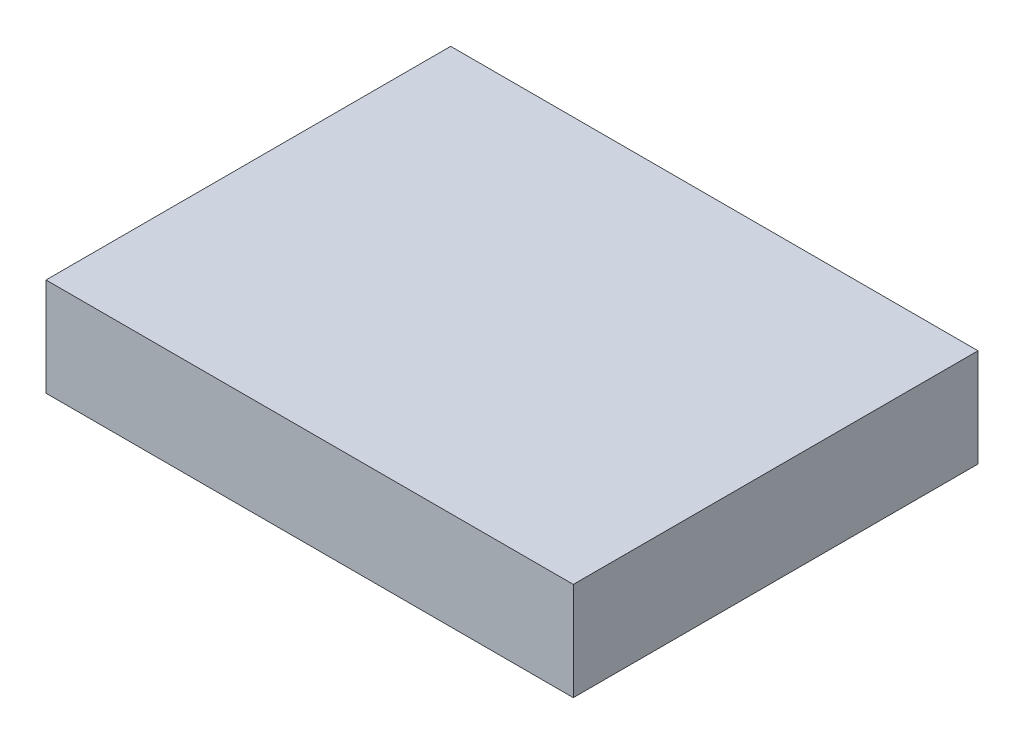
ISO-10303-21;
HEADER;
FILE_DESCRIPTION(('STEP AP214'),'2;1');
FILE_NAME('part.step','',(''),(''),'','','');
FILE_SCHEMA(('AUTOMOTIVE_DESIGN { 1 0 10303 214 1 1 1 1 }'));
ENDSEC;
DATA;
#1=APPLICATION_CONTEXT('core data for automotive mechanical design processes');
#2=APPLICATION_PROTOCOL_DEFINITION('international standard','automotive_design',2000,#1);
#3=PRODUCT_CONTEXT('',#1,'mechanical');
#4=PRODUCT('Part','Part','',(#3));
#5=PRODUCT_RELATED_PRODUCT_CATEGORY('part','',(#4));
#6=PRODUCT_DEFINITION_FORMATION('','',#4);
#7=PRODUCT_DEFINITION_CONTEXT('part definition',#1,'design');
#8=PRODUCT_DEFINITION('design','',#6,#7);
#9=PRODUCT_DEFINITION_SHAPE('','',#8);
#10=(LENGTH_UNIT() NAMED_UNIT(*) SI_UNIT(.MILLI.,.METRE.));
#11=(NAMED_UNIT(*) PLANE_ANGLE_UNIT() SI_UNIT($,.RADIAN.));
#12=(NAMED_UNIT(*) SI_UNIT($,.STERADIAN.) SOLID_ANGLE_UNIT());
#13=UNCERTAINTY_MEASURE_WITH_UNIT(LENGTH_MEASURE(1.E-05),#10,'distance_accuracy_value','');
#14=(GEOMETRIC_REPRESENTATION_CONTEXT(3) GLOBAL_UNCERTAINTY_ASSIGNED_CONTEXT((#13)) GLOBAL_UNIT_ASSIGNED_CONTEXT((#10,
#11,#12)) REPRESENTATION_CONTEXT('',''));
#15=CARTESIAN_POINT('',(0.,0.,0.));
#16=DIRECTION('',(0.,0.,1.));
#17=DIRECTION('',(1.,0.,0.));
#18=AXIS2_PLACEMENT_3D('',#15,#16,#17);
#19=CARTESIAN_POINT('',(43.,16.,33.));
#20=DIRECTION('',(-1.,0.,0.));
#21=DIRECTION('',(0.,0.,1.));
#22=AXIS2_PLACEMENT_3D('',#19,#20,#21);
#23=PLANE('',#22);
#24=DIRECTION('',(0.,0.,-1.));
#25=VECTOR('',#24,1.);
#26=CARTESIAN_POINT('',(43.,0.,33.));
#27=LINE('',#26,#25);
#28=CARTESIAN_POINT('',(43.,0.,33.));
#29=VERTEX_POINT('',#28);
#30=CARTESIAN_POINT('',(43.,0.,-33.));
#31=VERTEX_POINT('',#30);
#32=EDGE_CURVE('E150',#29,#31,#27,.T.);
#33=ORIENTED_EDGE('',*,*,#32,.T.);
#34=DIRECTION('',(0.,-1.,0.));
#35=VECTOR('',#34,1.);
#36=CARTESIAN_POINT('',(43.,16.,-33.));
#37=LINE('',#36,#35);
#38=CARTESIAN_POINT('',(43.,16.,-33.));
#39=VERTEX_POINT('',#38);
#40=EDGE_CURVE('E11',#39,#31,#37,.T.);
#41=ORIENTED_EDGE('',*,*,#40,.F.);
#42=DIRECTION('',(0.,0.,-1.));
#43=VECTOR('',#42,1.);
#44=CARTESIAN_POINT('',(43.,16.,33.));
#45=LINE('',#44,#43);
#46=CARTESIAN_POINT('',(43.,16.,33.));
#47=VERTEX_POINT('',#46);
#48=EDGE_CURVE('E151',#47,#39,#45,.T.);
#49=ORIENTED_EDGE('',*,*,#48,.F.);
#50=DIRECTION('',(0.,-1.,0.));
#51=VECTOR('',#50,1.);
#52=CARTESIAN_POINT('',(43.,16.,33.));
#53=LINE('',#52,#51);
#54=EDGE_CURVE('E160',#47,#29,#53,.T.);
#55=ORIENTED_EDGE('',*,*,#54,.T.);
#56=EDGE_LOOP('',(#33,#41,#49,#55));
#57=FACE_BOUND('',#56,.T.);
#58=ADVANCED_FACE('F39',(#57),#23,.F.);
#59=CARTESIAN_POINT('',(-43.,16.,-33.));
#60=DIRECTION('',(0.,0.,1.));
#61=DIRECTION('',(1.,0.,0.));
#62=AXIS2_PLACEMENT_3D('',#59,#60,#61);
#63=PLANE('',#62);
#64=DIRECTION('',(-1.,0.,0.));
#65=VECTOR('',#64,1.);
#66=CARTESIAN_POINT('',(-43.,0.,-33.));
#67=LINE('',#66,#65);
#68=CARTESIAN_POINT('',(-43.,0.,-33.));
#69=VERTEX_POINT('',#68);
#70=EDGE_CURVE('E158',#31,#69,#67,.T.);
#71=ORIENTED_EDGE('',*,*,#70,.T.);
#72=DIRECTION('',(0.,-1.,0.));
#73=VECTOR('',#72,1.);
#74=CARTESIAN_POINT('',(-43.,16.,-33.));
#75=LINE('',#74,#73);
#76=CARTESIAN_POINT('',(-43.,16.,-33.));
#77=VERTEX_POINT('',#76);
#78=EDGE_CURVE('E46',#77,#69,#75,.T.);
#79=ORIENTED_EDGE('',*,*,#78,.F.);
#80=DIRECTION('',(-1.,0.,0.));
#81=VECTOR('',#80,1.);
#82=CARTESIAN_POINT('',(-43.,16.,-33.));
#83=LINE('',#82,#81);
#84=EDGE_CURVE('E87',#39,#77,#83,.T.);
#85=ORIENTED_EDGE('',*,*,#84,.F.);
#86=ORIENTED_EDGE('',*,*,#40,.T.);
#87=EDGE_LOOP('',(#71,#79,#85,#86));
#88=FACE_BOUND('',#87,.T.);
#89=ADVANCED_FACE('F186',(#88),#63,.F.);
#90=CARTESIAN_POINT('',(-43.,16.,33.));
#91=DIRECTION('',(1.,0.,0.));
#92=DIRECTION('',(0.,0.,-1.));
#93=AXIS2_PLACEMENT_3D('',#90,#91,#92);
#94=PLANE('',#93);
#95=DIRECTION('',(0.,0.,1.));
#96=VECTOR('',#95,1.);
#97=CARTESIAN_POINT('',(-43.,0.,33.));
#98=LINE('',#97,#96);
#99=CARTESIAN_POINT('',(-43.,0.,33.));
#100=VERTEX_POINT('',#99);
#101=EDGE_CURVE('E165',#69,#100,#98,.T.);
#102=ORIENTED_EDGE('',*,*,#101,.T.);
#103=DIRECTION('',(0.,-1.,0.));
#104=VECTOR('',#103,1.);
#105=CARTESIAN_POINT('',(-43.,16.,33.));
#106=LINE('',#105,#104);
#107=CARTESIAN_POINT('',(-43.,16.,33.));
#108=VERTEX_POINT('',#107);
#109=EDGE_CURVE('E166',#108,#100,#106,.T.);
#110=ORIENTED_EDGE('',*,*,#109,.F.);
#111=DIRECTION('',(0.,0.,1.));
#112=VECTOR('',#111,1.);
#113=CARTESIAN_POINT('',(-43.,16.,33.));
#114=LINE('',#113,#112);
#115=EDGE_CURVE('E153',#77,#108,#114,.T.);
#116=ORIENTED_EDGE('',*,*,#115,.F.);
#117=ORIENTED_EDGE('',*,*,#78,.T.);
#118=EDGE_LOOP('',(#102,#110,#116,#117));
#119=FACE_BOUND('',#118,.T.);
#120=ADVANCED_FACE('F172',(#119),#94,.F.);
#121=CARTESIAN_POINT('',(-43.,16.,33.));
#122=DIRECTION('',(0.,0.,-1.));
#123=DIRECTION('',(-1.,0.,0.));
#124=AXIS2_PLACEMENT_3D('',#121,#122,#123);
#125=PLANE('',#124);
#126=DIRECTION('',(1.,0.,0.));
#127=VECTOR('',#126,1.);
#128=CARTESIAN_POINT('',(-43.,0.,33.));
#129=LINE('',#128,#127);
#130=EDGE_CURVE('E81',#100,#29,#129,.T.);
#131=ORIENTED_EDGE('',*,*,#130,.T.);
#132=ORIENTED_EDGE('',*,*,#54,.F.);
#133=DIRECTION('',(1.,0.,0.));
#134=VECTOR('',#133,1.);
#135=CARTESIAN_POINT('',(-43.,16.,33.));
#136=LINE('',#135,#134);
#137=EDGE_CURVE('E65',#108,#47,#136,.T.);
#138=ORIENTED_EDGE('',*,*,#137,.F.);
#139=ORIENTED_EDGE('',*,*,#109,.T.);
#140=EDGE_LOOP('',(#131,#132,#138,#139));
#141=FACE_BOUND('',#140,.T.);
#142=ADVANCED_FACE('F177',(#141),#125,.F.);
#143=CARTESIAN_POINT('',(0.,16.,0.));
#144=DIRECTION('',(0.,-1.,0.));
#145=DIRECTION('',(0.,0.,-1.));
#146=AXIS2_PLACEMENT_3D('',#143,#144,#145);
#147=PLANE('',#146);
#148=ORIENTED_EDGE('',*,*,#48,.T.);
#149=ORIENTED_EDGE('',*,*,#84,.T.);
#150=ORIENTED_EDGE('',*,*,#115,.T.);
#151=ORIENTED_EDGE('',*,*,#137,.T.);
#152=EDGE_LOOP('',(#148,#149,#150,#151));
#153=FACE_BOUND('',#152,.T.);
#154=ADVANCED_FACE('F183',(#153),#147,.F.);
#155=CARTESIAN_POINT('',(0.,0.,0.));
#156=DIRECTION('',(0.,-1.,0.));
#157=DIRECTION('',(0.,0.,-1.));
#158=AXIS2_PLACEMENT_3D('',#155,#156,#157);
#159=PLANE('',#158);
#160=DIRECTION('',(0.,0.,1.));
#161=VECTOR('',#160,1.);
#162=CARTESIAN_POINT('',(40.6,0.,-30.6));
#163=LINE('',#162,#161);
#164=CARTESIAN_POINT('',(40.6,0.,-30.6));
#165=VERTEX_POINT('',#164);
#166=CARTESIAN_POINT('',(40.6,0.,30.6));
#167=VERTEX_POINT('',#166);
#168=EDGE_CURVE('E52',#165,#167,#163,.T.);
#169=ORIENTED_EDGE('',*,*,#168,.F.);
#170=DIRECTION('',(1.,0.,0.));
#171=VECTOR('',#170,1.);
#172=CARTESIAN_POINT('',(-40.6,0.,-30.6));
#173=LINE('',#172,#171);
#174=CARTESIAN_POINT('',(-40.6,0.,-30.6));
#175=VERTEX_POINT('',#174);
#176=EDGE_CURVE('E132',#175,#165,#173,.T.);
#177=ORIENTED_EDGE('',*,*,#176,.F.);
#178=DIRECTION('',(0.,0.,-1.));
#179=VECTOR('',#178,1.);
#180=CARTESIAN_POINT('',(-40.6,0.,-30.6));
#181=LINE('',#180,#179);
#182=CARTESIAN_POINT('',(-40.6,0.,30.6));
#183=VERTEX_POINT('',#182);
#184=EDGE_CURVE('E134',#183,#175,#181,.T.);
#185=ORIENTED_EDGE('',*,*,#184,.F.);
#186=DIRECTION('',(-1.,0.,0.));
#187=VECTOR('',#186,1.);
#188=CARTESIAN_POINT('',(-40.6,0.,30.6));
#189=LINE('',#188,#187);
#190=EDGE_CURVE('E141',#167,#183,#189,.T.);
#191=ORIENTED_EDGE('',*,*,#190,.F.);
#192=EDGE_LOOP('',(#169,#177,#185,#191));
#193=FACE_BOUND('',#192,.T.);
#194=ORIENTED_EDGE('',*,*,#32,.F.);
#195=ORIENTED_EDGE('',*,*,#130,.F.);
#196=ORIENTED_EDGE('',*,*,#101,.F.);
#197=ORIENTED_EDGE('',*,*,#70,.F.);
#198=EDGE_LOOP('',(#194,#195,#196,#197));
#199=FACE_BOUND('',#198,.T.);
#200=ADVANCED_FACE('F173',(#193,#199),#159,.T.);
#201=CARTESIAN_POINT('',(40.6,13.6,-30.6));
#202=DIRECTION('',(1.,0.,0.));
#203=DIRECTION('',(0.,0.,-1.));
#204=AXIS2_PLACEMENT_3D('',#201,#202,#203);
#205=PLANE('',#204);
#206=ORIENTED_EDGE('',*,*,#168,.T.);
#207=DIRECTION('',(0.,-1.,0.));
#208=VECTOR('',#207,1.);
#209=CARTESIAN_POINT('',(40.6,13.6,30.6));
#210=LINE('',#209,#208);
#211=CARTESIAN_POINT('',(40.6,13.6,30.6));
#212=VERTEX_POINT('',#211);
#213=EDGE_CURVE('E108',#212,#167,#210,.T.);
#214=ORIENTED_EDGE('',*,*,#213,.F.);
#215=DIRECTION('',(0.,0.,1.));
#216=VECTOR('',#215,1.);
#217=CARTESIAN_POINT('',(40.6,13.6,-30.6));
#218=LINE('',#217,#216);
#219=CARTESIAN_POINT('',(40.6,13.6,-30.6));
#220=VERTEX_POINT('',#219);
#221=EDGE_CURVE('E111',#220,#212,#218,.T.);
#222=ORIENTED_EDGE('',*,*,#221,.F.);
#223=DIRECTION('',(0.,-1.,0.));
#224=VECTOR('',#223,1.);
#225=CARTESIAN_POINT('',(40.6,13.6,-30.6));
#226=LINE('',#225,#224);
#227=EDGE_CURVE('E144',#220,#165,#226,.T.);
#228=ORIENTED_EDGE('',*,*,#227,.T.);
#229=EDGE_LOOP('',(#206,#214,#222,#228));
#230=FACE_BOUND('',#229,.T.);
#231=ADVANCED_FACE('F115',(#230),#205,.F.);
#232=CARTESIAN_POINT('',(-40.6,13.6,-30.6));
#233=DIRECTION('',(0.,0.,-1.));
#234=DIRECTION('',(-1.,0.,0.));
#235=AXIS2_PLACEMENT_3D('',#232,#233,#234);
#236=PLANE('',#235);
#237=ORIENTED_EDGE('',*,*,#176,.T.);
#238=ORIENTED_EDGE('',*,*,#227,.F.);
#239=DIRECTION('',(1.,0.,0.));
#240=VECTOR('',#239,1.);
#241=CARTESIAN_POINT('',(-40.6,13.6,-30.6));
#242=LINE('',#241,#240);
#243=CARTESIAN_POINT('',(-40.6,13.6,-30.6));
#244=VERTEX_POINT('',#243);
#245=EDGE_CURVE('E119',#244,#220,#242,.T.);
#246=ORIENTED_EDGE('',*,*,#245,.F.);
#247=DIRECTION('',(0.,-1.,0.));
#248=VECTOR('',#247,1.);
#249=CARTESIAN_POINT('',(-40.6,13.6,-30.6));
#250=LINE('',#249,#248);
#251=EDGE_CURVE('E148',#244,#175,#250,.T.);
#252=ORIENTED_EDGE('',*,*,#251,.T.);
#253=EDGE_LOOP('',(#237,#238,#246,#252));
#254=FACE_BOUND('',#253,.T.);
#255=ADVANCED_FACE('F229',(#254),#236,.F.);
#256=CARTESIAN_POINT('',(-40.6,13.6,-30.6));
#257=DIRECTION('',(-1.,0.,0.));
#258=DIRECTION('',(0.,0.,1.));
#259=AXIS2_PLACEMENT_3D('',#256,#257,#258);
#260=PLANE('',#259);
#261=ORIENTED_EDGE('',*,*,#184,.T.);
#262=ORIENTED_EDGE('',*,*,#251,.F.);
#263=DIRECTION('',(0.,0.,-1.));
#264=VECTOR('',#263,1.);
#265=CARTESIAN_POINT('',(-40.6,13.6,-30.6));
#266=LINE('',#265,#264);
#267=CARTESIAN_POINT('',(-40.6,13.6,30.6));
#268=VERTEX_POINT('',#267);
#269=EDGE_CURVE('E126',#268,#244,#266,.T.);
#270=ORIENTED_EDGE('',*,*,#269,.F.);
#271=DIRECTION('',(0.,-1.,0.));
#272=VECTOR('',#271,1.);
#273=CARTESIAN_POINT('',(-40.6,13.6,30.6));
#274=LINE('',#273,#272);
#275=EDGE_CURVE('E117',#268,#183,#274,.T.);
#276=ORIENTED_EDGE('',*,*,#275,.T.);
#277=EDGE_LOOP('',(#261,#262,#270,#276));
#278=FACE_BOUND('',#277,.T.);
#279=ADVANCED_FACE('F239',(#278),#260,.F.);
#280=CARTESIAN_POINT('',(-40.6,13.6,30.6));
#281=DIRECTION('',(0.,0.,1.));
#282=DIRECTION('',(1.,0.,0.));
#283=AXIS2_PLACEMENT_3D('',#280,#281,#282);
#284=PLANE('',#283);
#285=ORIENTED_EDGE('',*,*,#190,.T.);
#286=ORIENTED_EDGE('',*,*,#275,.F.);
#287=DIRECTION('',(-1.,0.,0.));
#288=VECTOR('',#287,1.);
#289=CARTESIAN_POINT('',(-40.6,13.6,30.6));
#290=LINE('',#289,#288);
#291=EDGE_CURVE('E121',#212,#268,#290,.T.);
#292=ORIENTED_EDGE('',*,*,#291,.F.);
#293=ORIENTED_EDGE('',*,*,#213,.T.);
#294=EDGE_LOOP('',(#285,#286,#292,#293));
#295=FACE_BOUND('',#294,.T.);
#296=ADVANCED_FACE('F124',(#295),#284,.F.);
#297=CARTESIAN_POINT('',(0.,13.6,0.));
#298=DIRECTION('',(0.,1.,0.));
#299=DIRECTION('',(0.,0.,1.));
#300=AXIS2_PLACEMENT_3D('',#297,#298,#299);
#301=PLANE('',#300);
#302=ORIENTED_EDGE('',*,*,#221,.T.);
#303=ORIENTED_EDGE('',*,*,#291,.T.);
#304=ORIENTED_EDGE('',*,*,#269,.T.);
#305=ORIENTED_EDGE('',*,*,#245,.T.);
#306=EDGE_LOOP('',(#302,#303,#304,#305));
#307=FACE_BOUND('',#306,.T.);
#308=ADVANCED_FACE('F129',(#307),#301,.F.);
#309=CLOSED_SHELL('',(#58,#89,#120,#142,#154,#200,#231,#255,#279,#296,#308));
#310=MANIFOLD_SOLID_BREP('B2',#309);
#311=ADVANCED_BREP_SHAPE_REPRESENTATION('',(#18,#310),#14);
#312=SHAPE_DEFINITION_REPRESENTATION(#9,#311);
ENDSEC;
END-ISO-10303-21;
